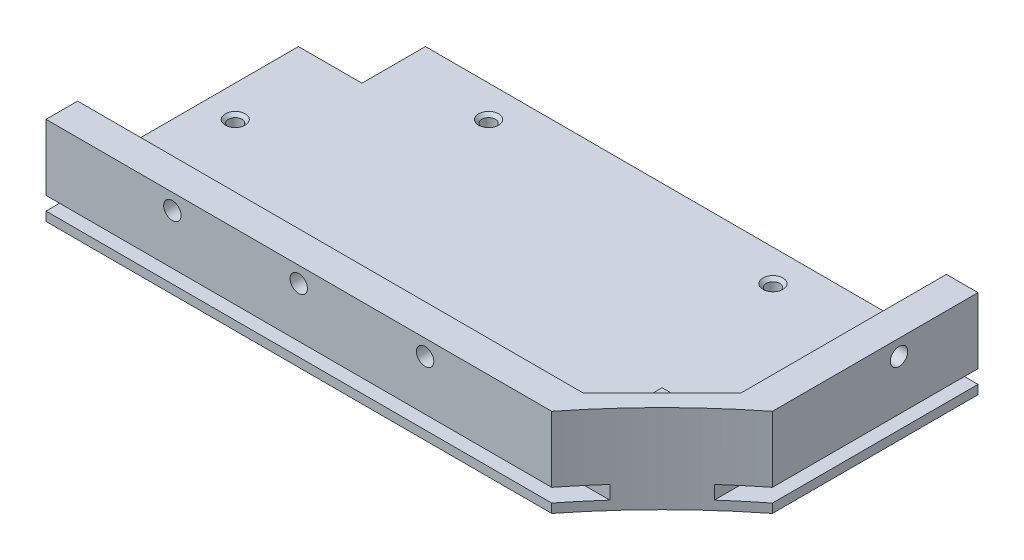
ISO-10303-21;
HEADER;
FILE_DESCRIPTION(('STEP AP214'),'2;1');
FILE_NAME('part.step','',(''),(''),'','','');
FILE_SCHEMA(('AUTOMOTIVE_DESIGN { 1 0 10303 214 1 1 1 1 }'));
ENDSEC;
DATA;
#1=APPLICATION_CONTEXT('core data for automotive mechanical design processes');
#2=APPLICATION_PROTOCOL_DEFINITION('international standard','automotive_design',2000,#1);
#3=PRODUCT_CONTEXT('',#1,'mechanical');
#4=PRODUCT('Part','Part','',(#3));
#5=PRODUCT_RELATED_PRODUCT_CATEGORY('part','',(#4));
#6=PRODUCT_DEFINITION_FORMATION('','',#4);
#7=PRODUCT_DEFINITION_CONTEXT('part definition',#1,'design');
#8=PRODUCT_DEFINITION('design','',#6,#7);
#9=PRODUCT_DEFINITION_SHAPE('','',#8);
#10=(LENGTH_UNIT() NAMED_UNIT(*) SI_UNIT(.MILLI.,.METRE.));
#11=(NAMED_UNIT(*) PLANE_ANGLE_UNIT() SI_UNIT($,.RADIAN.));
#12=(NAMED_UNIT(*) SI_UNIT($,.STERADIAN.) SOLID_ANGLE_UNIT());
#13=UNCERTAINTY_MEASURE_WITH_UNIT(LENGTH_MEASURE(1.E-05),#10,'distance_accuracy_value','');
#14=(GEOMETRIC_REPRESENTATION_CONTEXT(3) GLOBAL_UNCERTAINTY_ASSIGNED_CONTEXT((#13)) GLOBAL_UNIT_ASSIGNED_CONTEXT((#10,
#11,#12)) REPRESENTATION_CONTEXT('',''));
#15=CARTESIAN_POINT('',(0.,0.,0.));
#16=DIRECTION('',(0.,0.,1.));
#17=DIRECTION('',(1.,0.,0.));
#18=AXIS2_PLACEMENT_3D('',#15,#16,#17);
#19=CARTESIAN_POINT('',(160.08,28.,-429.92));
#20=DIRECTION('',(1.,0.,0.));
#21=DIRECTION('',(0.,0.,-1.));
#22=AXIS2_PLACEMENT_3D('',#19,#20,#21);
#23=PLANE('',#22);
#24=DIRECTION('',(0.,0.,1.));
#25=VECTOR('',#24,1.);
#26=CARTESIAN_POINT('',(160.08,17.,-489.92));
#27=LINE('',#26,#25);
#28=CARTESIAN_POINT('',(160.08,17.,-489.92));
#29=VERTEX_POINT('',#28);
#30=CARTESIAN_POINT('',(160.08,17.,-465.));
#31=VERTEX_POINT('',#30);
#32=EDGE_CURVE('E480',#29,#31,#27,.T.);
#33=ORIENTED_EDGE('',*,*,#32,.F.);
#34=DIRECTION('',(0.,-1.,0.));
#35=VECTOR('',#34,1.);
#36=CARTESIAN_POINT('',(160.08,28.,-489.92));
#37=LINE('',#36,#35);
#38=CARTESIAN_POINT('',(160.08,8.,-489.92));
#39=VERTEX_POINT('',#38);
#40=EDGE_CURVE('E475',#29,#39,#37,.T.);
#41=ORIENTED_EDGE('',*,*,#40,.T.);
#42=DIRECTION('',(0.,0.,-1.));
#43=VECTOR('',#42,1.);
#44=CARTESIAN_POINT('',(160.08,8.,-429.92));
#45=LINE('',#44,#43);
#46=CARTESIAN_POINT('',(160.08,8.,-475.));
#47=VERTEX_POINT('',#46);
#48=EDGE_CURVE('E467',#47,#39,#45,.T.);
#49=ORIENTED_EDGE('',*,*,#48,.F.);
#50=DIRECTION('',(0.,-0.668964731622449,-0.743294146247167));
#51=VECTOR('',#50,1.);
#52=CARTESIAN_POINT('',(160.08,17.,-465.));
#53=LINE('',#52,#51);
#54=EDGE_CURVE('E422',#31,#47,#53,.T.);
#55=ORIENTED_EDGE('',*,*,#54,.F.);
#56=EDGE_LOOP('',(#33,#41,#49,#55));
#57=FACE_BOUND('',#56,.T.);
#58=ADVANCED_FACE('F45',(#57),#23,.F.);
#59=CARTESIAN_POINT('',(0.,0.,-489.92));
#60=DIRECTION('',(0.,0.,1.));
#61=DIRECTION('',(1.,0.,0.));
#62=AXIS2_PLACEMENT_3D('',#59,#60,#61);
#63=PLANE('',#62);
#64=DIRECTION('',(-1.,0.,0.));
#65=VECTOR('',#64,1.);
#66=CARTESIAN_POINT('',(185.,17.,-489.92));
#67=LINE('',#66,#65);
#68=CARTESIAN_POINT('',(185.,17.,-489.92));
#69=VERTEX_POINT('',#68);
#70=EDGE_CURVE('E487',#69,#29,#67,.T.);
#71=ORIENTED_EDGE('',*,*,#70,.F.);
#72=DIRECTION('',(0.743294146247166,0.66896473162245,0.));
#73=VECTOR('',#72,1.);
#74=CARTESIAN_POINT('',(185.,17.,-489.92));
#75=LINE('',#74,#73);
#76=CARTESIAN_POINT('',(175.,8.,-489.92));
#77=VERTEX_POINT('',#76);
#78=EDGE_CURVE('E415',#77,#69,#75,.T.);
#79=ORIENTED_EDGE('',*,*,#78,.F.);
#80=DIRECTION('',(1.,0.,0.));
#81=VECTOR('',#80,1.);
#82=CARTESIAN_POINT('',(160.08,8.,-489.92));
#83=LINE('',#82,#81);
#84=EDGE_CURVE('E472',#39,#77,#83,.T.);
#85=ORIENTED_EDGE('',*,*,#84,.F.);
#86=ORIENTED_EDGE('',*,*,#40,.F.);
#87=EDGE_LOOP('',(#71,#79,#85,#86));
#88=FACE_BOUND('',#87,.T.);
#89=ADVANCED_FACE('F292',(#88),#63,.F.);
#90=CARTESIAN_POINT('',(0.,8.,0.));
#91=DIRECTION('',(0.,-1.,0.));
#92=DIRECTION('',(0.,0.,-1.));
#93=AXIS2_PLACEMENT_3D('',#90,#91,#92);
#94=PLANE('',#93);
#95=CARTESIAN_POINT('',(140.1,8.,-545.));
#96=DIRECTION('',(0.,-1.,0.));
#97=DIRECTION('',(0.,0.,-1.));
#98=AXIS2_PLACEMENT_3D('',#95,#96,#97);
#99=CIRCLE('',#98,3.14999999999999);
#100=CARTESIAN_POINT('',(140.1,8.,-548.15));
#101=VERTEX_POINT('',#100);
#102=EDGE_CURVE('E269',#101,#101,#99,.T.);
#103=ORIENTED_EDGE('',*,*,#102,.T.);
#104=EDGE_LOOP('',(#103));
#105=FACE_BOUND('',#104,.T.);
#106=CARTESIAN_POINT('',(50.1,8.,-545.));
#107=DIRECTION('',(0.,-1.,0.));
#108=DIRECTION('',(0.,0.,-1.));
#109=AXIS2_PLACEMENT_3D('',#106,#107,#108);
#110=CIRCLE('',#109,3.14999999999999);
#111=CARTESIAN_POINT('',(50.1,8.,-548.15));
#112=VERTEX_POINT('',#111);
#113=EDGE_CURVE('E266',#112,#112,#110,.T.);
#114=ORIENTED_EDGE('',*,*,#113,.T.);
#115=EDGE_LOOP('',(#114));
#116=FACE_BOUND('',#115,.T.);
#117=CARTESIAN_POINT('',(10.,8.,-504.9));
#118=DIRECTION('',(0.,-1.,0.));
#119=DIRECTION('',(0.,0.,-1.));
#120=AXIS2_PLACEMENT_3D('',#117,#118,#119);
#121=CIRCLE('',#120,3.14999999999999);
#122=CARTESIAN_POINT('',(10.,8.,-508.05));
#123=VERTEX_POINT('',#122);
#124=EDGE_CURVE('E263',#123,#123,#121,.T.);
#125=ORIENTED_EDGE('',*,*,#124,.T.);
#126=EDGE_LOOP('',(#125));
#127=FACE_BOUND('',#126,.T.);
#128=DIRECTION('',(-1.,0.,0.));
#129=VECTOR('',#128,1.);
#130=CARTESIAN_POINT('',(0.,8.,-555.));
#131=LINE('',#130,#129);
#132=CARTESIAN_POINT('',(175.,8.,-555.));
#133=VERTEX_POINT('',#132);
#134=CARTESIAN_POINT('',(20.1,8.,-555.));
#135=VERTEX_POINT('',#134);
#136=EDGE_CURVE('E509',#133,#135,#131,.T.);
#137=ORIENTED_EDGE('',*,*,#136,.T.);
#138=DIRECTION('',(0.,0.,1.));
#139=VECTOR('',#138,1.);
#140=CARTESIAN_POINT('',(20.1000000000001,8.,0.));
#141=LINE('',#140,#139);
#142=CARTESIAN_POINT('',(20.1,8.,-534.9));
#143=VERTEX_POINT('',#142);
#144=EDGE_CURVE('E61',#135,#143,#141,.T.);
#145=ORIENTED_EDGE('',*,*,#144,.T.);
#146=DIRECTION('',(-1.,0.,0.));
#147=VECTOR('',#146,1.);
#148=CARTESIAN_POINT('',(0.,8.,-534.9));
#149=LINE('',#148,#147);
#150=CARTESIAN_POINT('',(0.,8.,-534.9));
#151=VERTEX_POINT('',#150);
#152=EDGE_CURVE('E532',#143,#151,#149,.T.);
#153=ORIENTED_EDGE('',*,*,#152,.T.);
#154=DIRECTION('',(0.,0.,1.));
#155=VECTOR('',#154,1.);
#156=CARTESIAN_POINT('',(0.,8.,0.));
#157=LINE('',#156,#155);
#158=CARTESIAN_POINT('',(0.,8.,-475.));
#159=VERTEX_POINT('',#158);
#160=EDGE_CURVE('E215',#151,#159,#157,.T.);
#161=ORIENTED_EDGE('',*,*,#160,.T.);
#162=DIRECTION('',(-1.,0.,0.));
#163=VECTOR('',#162,1.);
#164=CARTESIAN_POINT('',(160.08,8.,-475.));
#165=LINE('',#164,#163);
#166=EDGE_CURVE('E418',#47,#159,#165,.T.);
#167=ORIENTED_EDGE('',*,*,#166,.F.);
#168=ORIENTED_EDGE('',*,*,#48,.T.);
#169=ORIENTED_EDGE('',*,*,#84,.T.);
#170=DIRECTION('',(0.,0.,-1.));
#171=VECTOR('',#170,1.);
#172=CARTESIAN_POINT('',(175.,8.,-489.92));
#173=LINE('',#172,#171);
#174=EDGE_CURVE('E401',#77,#133,#173,.T.);
#175=ORIENTED_EDGE('',*,*,#174,.T.);
#176=EDGE_LOOP('',(#137,#145,#153,#161,#167,#168,#169,#175));
#177=FACE_BOUND('',#176,.T.);
#178=ADVANCED_FACE('F299',(#105,#116,#127,#177),#94,.F.);
#179=CARTESIAN_POINT('',(195.,0.,-489.924225024707));
#180=DIRECTION('',(1.,0.,0.));
#181=DIRECTION('',(0.,0.,-1.));
#182=AXIS2_PLACEMENT_3D('',#179,#180,#181);
#183=PLANE('',#182);
#184=DIRECTION('',(0.,1.,0.));
#185=VECTOR('',#184,1.);
#186=CARTESIAN_POINT('',(195.,0.,-555.));
#187=LINE('',#186,#185);
#188=CARTESIAN_POINT('',(195.,7.15,-555.));
#189=VERTEX_POINT('',#188);
#190=CARTESIAN_POINT('',(195.,28.,-555.));
#191=VERTEX_POINT('',#190);
#192=EDGE_CURVE('E527',#189,#191,#187,.T.);
#193=ORIENTED_EDGE('',*,*,#192,.T.);
#194=DIRECTION('',(0.,0.,-1.));
#195=VECTOR('',#194,1.);
#196=CARTESIAN_POINT('',(195.,28.,-489.92));
#197=LINE('',#196,#195);
#198=CARTESIAN_POINT('',(195.,28.,-489.924225024706));
#199=VERTEX_POINT('',#198);
#200=EDGE_CURVE('E400',#199,#191,#197,.T.);
#201=ORIENTED_EDGE('',*,*,#200,.F.);
#202=DIRECTION('',(0.,1.,0.));
#203=VECTOR('',#202,1.);
#204=CARTESIAN_POINT('',(195.,0.,-489.924225024707));
#205=LINE('',#204,#203);
#206=CARTESIAN_POINT('',(195.,7.15,-489.924225024707));
#207=VERTEX_POINT('',#206);
#208=EDGE_CURVE('E232',#199,#207,#205,.F.);
#209=ORIENTED_EDGE('',*,*,#208,.T.);
#210=DIRECTION('',(0.,0.,1.));
#211=VECTOR('',#210,1.);
#212=CARTESIAN_POINT('',(195.,7.15,-489.924225024707));
#213=LINE('',#212,#211);
#214=EDGE_CURVE('E245',#189,#207,#213,.T.);
#215=ORIENTED_EDGE('',*,*,#214,.F.);
#216=EDGE_LOOP('',(#193,#201,#209,#215));
#217=FACE_BOUND('',#216,.T.);
#218=CARTESIAN_POINT('',(195.,23.,-530.));
#219=DIRECTION('',(1.,0.,0.));
#220=DIRECTION('',(0.,0.,-1.));
#221=AXIS2_PLACEMENT_3D('',#218,#219,#220);
#222=CIRCLE('',#221,2.75000000000004);
#223=CARTESIAN_POINT('',(195.,23.,-532.75));
#224=VERTEX_POINT('',#223);
#225=EDGE_CURVE('E484',#224,#224,#222,.T.);
#226=ORIENTED_EDGE('',*,*,#225,.F.);
#227=EDGE_LOOP('',(#226));
#228=FACE_BOUND('',#227,.T.);
#229=ADVANCED_FACE('F355',(#217,#228),#183,.T.);
#230=CARTESIAN_POINT('',(195.,0.,-455.));
#231=DIRECTION('',(0.,0.,1.));
#232=DIRECTION('',(1.,0.,0.));
#233=AXIS2_PLACEMENT_3D('',#230,#231,#232);
#234=PLANE('',#233);
#235=DIRECTION('',(1.,0.,0.));
#236=VECTOR('',#235,1.);
#237=CARTESIAN_POINT('',(195.,2.85,-455.));
#238=LINE('',#237,#236);
#239=CARTESIAN_POINT('',(0.,2.85,-455.));
#240=VERTEX_POINT('',#239);
#241=CARTESIAN_POINT('',(160.075774975293,2.85,-455.));
#242=VERTEX_POINT('',#241);
#243=EDGE_CURVE('E237',#240,#242,#238,.T.);
#244=ORIENTED_EDGE('',*,*,#243,.F.);
#245=DIRECTION('',(0.,1.,0.));
#246=VECTOR('',#245,1.);
#247=CARTESIAN_POINT('',(0.,0.,-455.));
#248=LINE('',#247,#246);
#249=CARTESIAN_POINT('',(0.,0.,-455.));
#250=VERTEX_POINT('',#249);
#251=EDGE_CURVE('E225',#250,#240,#248,.T.);
#252=ORIENTED_EDGE('',*,*,#251,.F.);
#253=DIRECTION('',(1.,0.,0.));
#254=VECTOR('',#253,1.);
#255=CARTESIAN_POINT('',(160.075774975293,0.,-455.));
#256=LINE('',#255,#254);
#257=CARTESIAN_POINT('',(160.075774975293,0.,-455.));
#258=VERTEX_POINT('',#257);
#259=EDGE_CURVE('E220',#250,#258,#256,.T.);
#260=ORIENTED_EDGE('',*,*,#259,.T.);
#261=DIRECTION('',(0.,1.,0.));
#262=VECTOR('',#261,1.);
#263=CARTESIAN_POINT('',(160.075774975293,0.,-455.));
#264=LINE('',#263,#262);
#265=EDGE_CURVE('E228',#258,#242,#264,.T.);
#266=ORIENTED_EDGE('',*,*,#265,.T.);
#267=EDGE_LOOP('',(#244,#252,#260,#266));
#268=FACE_BOUND('',#267,.T.);
#269=ADVANCED_FACE('F360',(#268),#234,.T.);
#270=CARTESIAN_POINT('',(0.,8.,0.));
#271=DIRECTION('',(1.,0.,0.));
#272=DIRECTION('',(0.,0.,-1.));
#273=AXIS2_PLACEMENT_3D('',#270,#271,#272);
#274=PLANE('',#273);
#275=ORIENTED_EDGE('',*,*,#160,.F.);
#276=DIRECTION('',(0.,1.,0.));
#277=VECTOR('',#276,1.);
#278=CARTESIAN_POINT('',(0.,0.,-534.9));
#279=LINE('',#278,#277);
#280=CARTESIAN_POINT('',(0.,0.,-534.9));
#281=VERTEX_POINT('',#280);
#282=EDGE_CURVE('E198',#281,#151,#279,.T.);
#283=ORIENTED_EDGE('',*,*,#282,.F.);
#284=DIRECTION('',(0.,0.,1.));
#285=VECTOR('',#284,1.);
#286=CARTESIAN_POINT('',(0.,0.,0.));
#287=LINE('',#286,#285);
#288=EDGE_CURVE('E212',#281,#250,#287,.T.);
#289=ORIENTED_EDGE('',*,*,#288,.T.);
#290=ORIENTED_EDGE('',*,*,#251,.T.);
#291=DIRECTION('',(0.,0.,1.));
#292=VECTOR('',#291,1.);
#293=CARTESIAN_POINT('',(0.,2.85,-465.));
#294=LINE('',#293,#292);
#295=CARTESIAN_POINT('',(0.,2.85,-465.));
#296=VERTEX_POINT('',#295);
#297=EDGE_CURVE('E391',#296,#240,#294,.T.);
#298=ORIENTED_EDGE('',*,*,#297,.F.);
#299=DIRECTION('',(0.,-1.,0.));
#300=VECTOR('',#299,1.);
#301=CARTESIAN_POINT('',(0.,7.15,-465.));
#302=LINE('',#301,#300);
#303=CARTESIAN_POINT('',(0.,7.15,-465.));
#304=VERTEX_POINT('',#303);
#305=EDGE_CURVE('E451',#304,#296,#302,.T.);
#306=ORIENTED_EDGE('',*,*,#305,.F.);
#307=DIRECTION('',(0.,0.,-1.));
#308=VECTOR('',#307,1.);
#309=CARTESIAN_POINT('',(0.,7.15,-455.));
#310=LINE('',#309,#308);
#311=CARTESIAN_POINT('',(0.,7.15,-455.));
#312=VERTEX_POINT('',#311);
#313=EDGE_CURVE('E454',#312,#304,#310,.T.);
#314=ORIENTED_EDGE('',*,*,#313,.F.);
#315=CARTESIAN_POINT('',(0.,28.,-455.));
#316=VERTEX_POINT('',#315);
#317=EDGE_CURVE('E392',#312,#316,#248,.T.);
#318=ORIENTED_EDGE('',*,*,#317,.T.);
#319=DIRECTION('',(0.,0.,-1.));
#320=VECTOR('',#319,1.);
#321=CARTESIAN_POINT('',(0.,28.,-455.));
#322=LINE('',#321,#320);
#323=CARTESIAN_POINT('',(0.,28.,-465.));
#324=VERTEX_POINT('',#323);
#325=EDGE_CURVE('E434',#316,#324,#322,.T.);
#326=ORIENTED_EDGE('',*,*,#325,.T.);
#327=DIRECTION('',(0.,-1.,0.));
#328=VECTOR('',#327,1.);
#329=CARTESIAN_POINT('',(0.,28.,-465.));
#330=LINE('',#329,#328);
#331=CARTESIAN_POINT('',(0.,17.,-465.));
#332=VERTEX_POINT('',#331);
#333=EDGE_CURVE('E431',#324,#332,#330,.T.);
#334=ORIENTED_EDGE('',*,*,#333,.T.);
#335=DIRECTION('',(0.,-0.668964731622449,-0.743294146247167));
#336=VECTOR('',#335,1.);
#337=CARTESIAN_POINT('',(0.,17.,-465.));
#338=LINE('',#337,#336);
#339=EDGE_CURVE('E428',#332,#159,#338,.T.);
#340=ORIENTED_EDGE('',*,*,#339,.T.);
#341=EDGE_LOOP('',(#275,#283,#289,#290,#298,#306,#314,#318,#326,#334,#340));
#342=FACE_BOUND('',#341,.T.);
#343=ADVANCED_FACE('F210',(#342),#274,.F.);
#344=CARTESIAN_POINT('',(0.,0.,0.));
#345=DIRECTION('',(0.,-1.,0.));
#346=DIRECTION('',(0.,0.,-1.));
#347=AXIS2_PLACEMENT_3D('',#344,#345,#346);
#348=PLANE('',#347);
#349=CARTESIAN_POINT('',(10.,0.,-504.9));
#350=DIRECTION('',(0.,-1.,0.));
#351=DIRECTION('',(0.,0.,-1.));
#352=AXIS2_PLACEMENT_3D('',#349,#350,#351);
#353=CIRCLE('',#352,2.15000000000002);
#354=CARTESIAN_POINT('',(10.,0.,-507.05));
#355=VERTEX_POINT('',#354);
#356=EDGE_CURVE('E206',#355,#355,#353,.T.);
#357=ORIENTED_EDGE('',*,*,#356,.F.);
#358=EDGE_LOOP('',(#357));
#359=FACE_BOUND('',#358,.T.);
#360=CARTESIAN_POINT('',(140.1,0.,-545.));
#361=DIRECTION('',(0.,-1.,0.));
#362=DIRECTION('',(0.,0.,-1.));
#363=AXIS2_PLACEMENT_3D('',#360,#361,#362);
#364=CIRCLE('',#363,2.15000000000002);
#365=CARTESIAN_POINT('',(140.1,0.,-547.15));
#366=VERTEX_POINT('',#365);
#367=EDGE_CURVE('E256',#366,#366,#364,.T.);
#368=ORIENTED_EDGE('',*,*,#367,.F.);
#369=EDGE_LOOP('',(#368));
#370=FACE_BOUND('',#369,.T.);
#371=CARTESIAN_POINT('',(50.1,0.,-545.));
#372=DIRECTION('',(0.,-1.,0.));
#373=DIRECTION('',(0.,0.,-1.));
#374=AXIS2_PLACEMENT_3D('',#371,#372,#373);
#375=CIRCLE('',#374,2.15000000000003);
#376=CARTESIAN_POINT('',(50.1,0.,-547.15));
#377=VERTEX_POINT('',#376);
#378=EDGE_CURVE('E253',#377,#377,#375,.T.);
#379=ORIENTED_EDGE('',*,*,#378,.F.);
#380=EDGE_LOOP('',(#379));
#381=FACE_BOUND('',#380,.T.);
#382=DIRECTION('',(0.,0.,-1.));
#383=VECTOR('',#382,1.);
#384=CARTESIAN_POINT('',(20.1,0.,-555.));
#385=LINE('',#384,#383);
#386=CARTESIAN_POINT('',(20.1,0.,-534.9));
#387=VERTEX_POINT('',#386);
#388=CARTESIAN_POINT('',(20.1,0.,-555.));
#389=VERTEX_POINT('',#388);
#390=EDGE_CURVE('E205',#387,#389,#385,.T.);
#391=ORIENTED_EDGE('',*,*,#390,.T.);
#392=DIRECTION('',(1.,0.,0.));
#393=VECTOR('',#392,1.);
#394=CARTESIAN_POINT('',(195.,0.,-555.));
#395=LINE('',#394,#393);
#396=CARTESIAN_POINT('',(195.,0.,-555.));
#397=VERTEX_POINT('',#396);
#398=EDGE_CURVE('E528',#389,#397,#395,.T.);
#399=ORIENTED_EDGE('',*,*,#398,.T.);
#400=DIRECTION('',(0.,0.,-1.));
#401=VECTOR('',#400,1.);
#402=CARTESIAN_POINT('',(195.,0.,-455.));
#403=LINE('',#402,#401);
#404=CARTESIAN_POINT('',(195.,0.,-489.924225024707));
#405=VERTEX_POINT('',#404);
#406=EDGE_CURVE('E395',#405,#397,#403,.T.);
#407=ORIENTED_EDGE('',*,*,#406,.F.);
#408=CARTESIAN_POINT('',(325.,0.,-325.));
#409=DIRECTION('',(0.,1.,0.));
#410=DIRECTION('',(0.,0.,1.));
#411=AXIS2_PLACEMENT_3D('',#408,#409,#410);
#412=CIRCLE('',#411,210.);
#413=EDGE_CURVE('E221',#405,#258,#412,.T.);
#414=ORIENTED_EDGE('',*,*,#413,.T.);
#415=ORIENTED_EDGE('',*,*,#259,.F.);
#416=ORIENTED_EDGE('',*,*,#288,.F.);
#417=DIRECTION('',(1.,0.,0.));
#418=VECTOR('',#417,1.);
#419=CARTESIAN_POINT('',(20.1,0.,-534.9));
#420=LINE('',#419,#418);
#421=EDGE_CURVE('E195',#281,#387,#420,.T.);
#422=ORIENTED_EDGE('',*,*,#421,.T.);
#423=EDGE_LOOP('',(#391,#399,#407,#414,#415,#416,#422));
#424=FACE_BOUND('',#423,.T.);
#425=ADVANCED_FACE('F218',(#359,#370,#381,#424),#348,.T.);
#426=CARTESIAN_POINT('',(325.,0.,-325.));
#427=DIRECTION('',(0.,1.,0.));
#428=DIRECTION('',(0.,0.,1.));
#429=AXIS2_PLACEMENT_3D('',#426,#427,#428);
#430=CYLINDRICAL_SURFACE('',#429,210.);
#431=ORIENTED_EDGE('',*,*,#208,.F.);
#432=CARTESIAN_POINT('',(325.,28.,-325.));
#433=DIRECTION('',(0.,1.,0.));
#434=DIRECTION('',(0.,0.,1.));
#435=AXIS2_PLACEMENT_3D('',#432,#433,#434);
#436=CIRCLE('',#435,210.);
#437=CARTESIAN_POINT('',(160.075774975294,28.,-455.));
#438=VERTEX_POINT('',#437);
#439=EDGE_CURVE('E477',#199,#438,#436,.T.);
#440=ORIENTED_EDGE('',*,*,#439,.T.);
#441=CARTESIAN_POINT('',(160.075774975293,7.15,-455.));
#442=VERTEX_POINT('',#441);
#443=EDGE_CURVE('E223',#442,#438,#264,.T.);
#444=ORIENTED_EDGE('',*,*,#443,.F.);
#445=CARTESIAN_POINT('',(325.,7.15000000000001,-325.));
#446=DIRECTION('',(0.,1.,0.));
#447=DIRECTION('',(0.,0.,1.));
#448=AXIS2_PLACEMENT_3D('',#445,#446,#447);
#449=CIRCLE('',#448,210.);
#450=CARTESIAN_POINT('',(168.475241575015,7.15,-465.));
#451=VERTEX_POINT('',#450);
#452=EDGE_CURVE('E443',#442,#451,#449,.F.);
#453=ORIENTED_EDGE('',*,*,#452,.T.);
#454=DIRECTION('',(0.,1.,0.));
#455=VECTOR('',#454,1.);
#456=CARTESIAN_POINT('',(168.475241575015,0.,-465.));
#457=LINE('',#456,#455);
#458=CARTESIAN_POINT('',(168.475241575015,2.85,-465.));
#459=VERTEX_POINT('',#458);
#460=EDGE_CURVE('E239',#451,#459,#457,.F.);
#461=ORIENTED_EDGE('',*,*,#460,.T.);
#462=CARTESIAN_POINT('',(325.,2.85,-325.));
#463=DIRECTION('',(0.,-1.,0.));
#464=DIRECTION('',(0.,0.,-1.));
#465=AXIS2_PLACEMENT_3D('',#462,#463,#464);
#466=CIRCLE('',#465,210.);
#467=EDGE_CURVE('E437',#459,#242,#466,.F.);
#468=ORIENTED_EDGE('',*,*,#467,.T.);
#469=ORIENTED_EDGE('',*,*,#265,.F.);
#470=ORIENTED_EDGE('',*,*,#413,.F.);
#471=CARTESIAN_POINT('',(195.,2.85,-489.924225024707));
#472=VERTEX_POINT('',#471);
#473=EDGE_CURVE('E231',#472,#405,#205,.F.);
#474=ORIENTED_EDGE('',*,*,#473,.F.);
#475=CARTESIAN_POINT('',(325.,2.84999999999998,-325.));
#476=DIRECTION('',(0.,-1.,0.));
#477=DIRECTION('',(1.,0.,0.));
#478=AXIS2_PLACEMENT_3D('',#475,#476,#477);
#479=CIRCLE('',#478,210.);
#480=CARTESIAN_POINT('',(185.,2.85,-481.524758424985));
#481=VERTEX_POINT('',#480);
#482=EDGE_CURVE('E460',#472,#481,#479,.F.);
#483=ORIENTED_EDGE('',*,*,#482,.T.);
#484=DIRECTION('',(0.,1.,0.));
#485=VECTOR('',#484,1.);
#486=CARTESIAN_POINT('',(185.,0.,-481.524758424985));
#487=LINE('',#486,#485);
#488=CARTESIAN_POINT('',(185.,7.15,-481.524758424985));
#489=VERTEX_POINT('',#488);
#490=EDGE_CURVE('E247',#481,#489,#487,.T.);
#491=ORIENTED_EDGE('',*,*,#490,.T.);
#492=CARTESIAN_POINT('',(325.,7.15,-325.));
#493=DIRECTION('',(0.,1.,0.));
#494=DIRECTION('',(0.,0.,1.));
#495=AXIS2_PLACEMENT_3D('',#492,#493,#494);
#496=CIRCLE('',#495,210.);
#497=EDGE_CURVE('E457',#489,#207,#496,.F.);
#498=ORIENTED_EDGE('',*,*,#497,.T.);
#499=EDGE_LOOP('',(#431,#440,#444,#453,#461,#468,#469,#470,#474,#483,#491,#498));
#500=FACE_BOUND('',#499,.T.);
#501=ADVANCED_FACE('F358',(#500),#430,.F.);
#502=CARTESIAN_POINT('',(120.,23.,-455.));
#503=DIRECTION('',(0.,0.,1.));
#504=DIRECTION('',(1.,0.,0.));
#505=AXIS2_PLACEMENT_3D('',#502,#503,#504);
#506=CIRCLE('',#505,2.75000000000001);
#507=CARTESIAN_POINT('',(122.75,23.,-455.));
#508=VERTEX_POINT('',#507);
#509=EDGE_CURVE('E495',#508,#508,#506,.T.);
#510=ORIENTED_EDGE('',*,*,#509,.F.);
#511=EDGE_LOOP('',(#510));
#512=FACE_BOUND('',#511,.T.);
#513=CARTESIAN_POINT('',(80.,23.,-455.));
#514=DIRECTION('',(0.,0.,1.));
#515=DIRECTION('',(1.,0.,0.));
#516=AXIS2_PLACEMENT_3D('',#513,#514,#515);
#517=CIRCLE('',#516,2.75000000000001);
#518=CARTESIAN_POINT('',(82.75,23.,-455.));
#519=VERTEX_POINT('',#518);
#520=EDGE_CURVE('E498',#519,#519,#517,.T.);
#521=ORIENTED_EDGE('',*,*,#520,.F.);
#522=EDGE_LOOP('',(#521));
#523=FACE_BOUND('',#522,.T.);
#524=CARTESIAN_POINT('',(40.,23.,-455.));
#525=DIRECTION('',(0.,0.,1.));
#526=DIRECTION('',(1.,0.,0.));
#527=AXIS2_PLACEMENT_3D('',#524,#525,#526);
#528=CIRCLE('',#527,2.75);
#529=CARTESIAN_POINT('',(42.75,23.,-455.));
#530=VERTEX_POINT('',#529);
#531=EDGE_CURVE('E501',#530,#530,#528,.T.);
#532=ORIENTED_EDGE('',*,*,#531,.F.);
#533=EDGE_LOOP('',(#532));
#534=FACE_BOUND('',#533,.T.);
#535=ORIENTED_EDGE('',*,*,#443,.T.);
#536=DIRECTION('',(-1.,0.,0.));
#537=VECTOR('',#536,1.);
#538=CARTESIAN_POINT('',(160.08,28.,-455.));
#539=LINE('',#538,#537);
#540=EDGE_CURVE('E419',#438,#316,#539,.T.);
#541=ORIENTED_EDGE('',*,*,#540,.T.);
#542=ORIENTED_EDGE('',*,*,#317,.F.);
#543=DIRECTION('',(-1.,0.,0.));
#544=VECTOR('',#543,1.);
#545=CARTESIAN_POINT('',(195.,7.15,-455.));
#546=LINE('',#545,#544);
#547=EDGE_CURVE('E235',#442,#312,#546,.T.);
#548=ORIENTED_EDGE('',*,*,#547,.F.);
#549=EDGE_LOOP('',(#535,#541,#542,#548));
#550=FACE_BOUND('',#549,.T.);
#551=ADVANCED_FACE('F353',(#512,#523,#534,#550),#234,.T.);
#552=CARTESIAN_POINT('',(195.,2.85,-555.));
#553=VERTEX_POINT('',#552);
#554=EDGE_CURVE('E524',#397,#553,#187,.T.);
#555=ORIENTED_EDGE('',*,*,#554,.T.);
#556=DIRECTION('',(0.,0.,-1.));
#557=VECTOR('',#556,1.);
#558=CARTESIAN_POINT('',(195.,2.85,-489.924225024707));
#559=LINE('',#558,#557);
#560=EDGE_CURVE('E242',#472,#553,#559,.T.);
#561=ORIENTED_EDGE('',*,*,#560,.F.);
#562=ORIENTED_EDGE('',*,*,#473,.T.);
#563=ORIENTED_EDGE('',*,*,#406,.T.);
#564=EDGE_LOOP('',(#555,#561,#562,#563));
#565=FACE_BOUND('',#564,.T.);
#566=ADVANCED_FACE('F343',(#565),#183,.T.);
#567=CARTESIAN_POINT('',(195.,28.,-489.92));
#568=DIRECTION('',(0.,1.,0.));
#569=DIRECTION('',(0.,0.,1.));
#570=AXIS2_PLACEMENT_3D('',#567,#568,#569);
#571=PLANE('',#570);
#572=DIRECTION('',(1.,0.,0.));
#573=VECTOR('',#572,1.);
#574=CARTESIAN_POINT('',(195.,28.,-555.));
#575=LINE('',#574,#573);
#576=CARTESIAN_POINT('',(185.,28.,-555.));
#577=VERTEX_POINT('',#576);
#578=EDGE_CURVE('E530',#577,#191,#575,.T.);
#579=ORIENTED_EDGE('',*,*,#578,.F.);
#580=DIRECTION('',(0.,0.,-1.));
#581=VECTOR('',#580,1.);
#582=CARTESIAN_POINT('',(185.,28.,-489.92));
#583=LINE('',#582,#581);
#584=CARTESIAN_POINT('',(185.,28.,-489.92));
#585=VERTEX_POINT('',#584);
#586=EDGE_CURVE('E408',#585,#577,#583,.T.);
#587=ORIENTED_EDGE('',*,*,#586,.F.);
#588=DIRECTION('',(0.707106781186547,0.,-0.707106781186548));
#589=VECTOR('',#588,1.);
#590=CARTESIAN_POINT('',(160.08,28.,-465.));
#591=LINE('',#590,#589);
#592=CARTESIAN_POINT('',(160.08,28.,-465.));
#593=VERTEX_POINT('',#592);
#594=EDGE_CURVE('E481',#593,#585,#591,.T.);
#595=ORIENTED_EDGE('',*,*,#594,.F.);
#596=DIRECTION('',(-1.,0.,0.));
#597=VECTOR('',#596,1.);
#598=CARTESIAN_POINT('',(160.08,28.,-465.));
#599=LINE('',#598,#597);
#600=EDGE_CURVE('E421',#593,#324,#599,.T.);
#601=ORIENTED_EDGE('',*,*,#600,.T.);
#602=ORIENTED_EDGE('',*,*,#325,.F.);
#603=ORIENTED_EDGE('',*,*,#540,.F.);
#604=ORIENTED_EDGE('',*,*,#439,.F.);
#605=ORIENTED_EDGE('',*,*,#200,.T.);
#606=EDGE_LOOP('',(#579,#587,#595,#601,#602,#603,#604,#605));
#607=FACE_BOUND('',#606,.T.);
#608=ADVANCED_FACE('F339',(#607),#571,.T.);
#609=CARTESIAN_POINT('',(185.,28.,-489.92));
#610=DIRECTION('',(-1.,0.,0.));
#611=DIRECTION('',(0.,0.,1.));
#612=AXIS2_PLACEMENT_3D('',#609,#610,#611);
#613=PLANE('',#612);
#614=DIRECTION('',(0.,1.,0.));
#615=VECTOR('',#614,1.);
#616=CARTESIAN_POINT('',(185.,28.,-555.));
#617=LINE('',#616,#615);
#618=CARTESIAN_POINT('',(185.,17.,-555.));
#619=VERTEX_POINT('',#618);
#620=EDGE_CURVE('E516',#619,#577,#617,.T.);
#621=ORIENTED_EDGE('',*,*,#620,.F.);
#622=DIRECTION('',(0.,0.,-1.));
#623=VECTOR('',#622,1.);
#624=CARTESIAN_POINT('',(185.,17.,-489.92));
#625=LINE('',#624,#623);
#626=EDGE_CURVE('E404',#69,#619,#625,.T.);
#627=ORIENTED_EDGE('',*,*,#626,.F.);
#628=DIRECTION('',(0.,1.,0.));
#629=VECTOR('',#628,1.);
#630=CARTESIAN_POINT('',(185.,28.,-489.92));
#631=LINE('',#630,#629);
#632=EDGE_CURVE('E405',#69,#585,#631,.T.);
#633=ORIENTED_EDGE('',*,*,#632,.T.);
#634=ORIENTED_EDGE('',*,*,#586,.T.);
#635=EDGE_LOOP('',(#621,#627,#633,#634));
#636=FACE_BOUND('',#635,.T.);
#637=CARTESIAN_POINT('',(185.,23.,-530.));
#638=DIRECTION('',(-1.,0.,0.));
#639=DIRECTION('',(0.,0.,1.));
#640=AXIS2_PLACEMENT_3D('',#637,#638,#639);
#641=CIRCLE('',#640,2.75000000000004);
#642=CARTESIAN_POINT('',(185.,23.,-527.25));
#643=VERTEX_POINT('',#642);
#644=EDGE_CURVE('E492',#643,#643,#641,.T.);
#645=ORIENTED_EDGE('',*,*,#644,.F.);
#646=EDGE_LOOP('',(#645));
#647=FACE_BOUND('',#646,.T.);
#648=ADVANCED_FACE('F342',(#636,#647),#613,.T.);
#649=CARTESIAN_POINT('',(185.,17.,-489.92));
#650=DIRECTION('',(-0.66896473162245,0.743294146247166,0.));
#651=DIRECTION('',(-0.743294146247166,-0.668964731622451,0.));
#652=AXIS2_PLACEMENT_3D('',#649,#650,#651);
#653=PLANE('',#652);
#654=DIRECTION('',(0.743294146247166,0.668964731622451,0.));
#655=VECTOR('',#654,1.);
#656=CARTESIAN_POINT('',(185.,17.,-555.));
#657=LINE('',#656,#655);
#658=EDGE_CURVE('E518',#133,#619,#657,.T.);
#659=ORIENTED_EDGE('',*,*,#658,.F.);
#660=ORIENTED_EDGE('',*,*,#174,.F.);
#661=ORIENTED_EDGE('',*,*,#78,.T.);
#662=ORIENTED_EDGE('',*,*,#626,.T.);
#663=EDGE_LOOP('',(#659,#660,#661,#662));
#664=FACE_BOUND('',#663,.T.);
#665=ADVANCED_FACE('F334',(#664),#653,.T.);
#666=CARTESIAN_POINT('',(160.08,17.,-465.));
#667=DIRECTION('',(0.,0.743294146247167,-0.66896473162245));
#668=DIRECTION('',(0.,0.668964731622449,0.743294146247167));
#669=AXIS2_PLACEMENT_3D('',#666,#667,#668);
#670=PLANE('',#669);
#671=ORIENTED_EDGE('',*,*,#339,.F.);
#672=DIRECTION('',(-1.,0.,0.));
#673=VECTOR('',#672,1.);
#674=CARTESIAN_POINT('',(160.08,17.,-465.));
#675=LINE('',#674,#673);
#676=EDGE_CURVE('E424',#31,#332,#675,.T.);
#677=ORIENTED_EDGE('',*,*,#676,.F.);
#678=ORIENTED_EDGE('',*,*,#54,.T.);
#679=ORIENTED_EDGE('',*,*,#166,.T.);
#680=EDGE_LOOP('',(#671,#677,#678,#679));
#681=FACE_BOUND('',#680,.T.);
#682=ADVANCED_FACE('F331',(#681),#670,.T.);
#683=CARTESIAN_POINT('',(160.08,28.,-465.));
#684=DIRECTION('',(0.,0.,-1.));
#685=DIRECTION('',(-1.,0.,0.));
#686=AXIS2_PLACEMENT_3D('',#683,#684,#685);
#687=PLANE('',#686);
#688=CARTESIAN_POINT('',(120.,23.,-465.));
#689=DIRECTION('',(0.,0.,-1.));
#690=DIRECTION('',(-1.,0.,0.));
#691=AXIS2_PLACEMENT_3D('',#688,#689,#690);
#692=CIRCLE('',#691,2.75000000000001);
#693=CARTESIAN_POINT('',(117.25,23.,-465.));
#694=VERTEX_POINT('',#693);
#695=EDGE_CURVE('E504',#694,#694,#692,.T.);
#696=ORIENTED_EDGE('',*,*,#695,.F.);
#697=EDGE_LOOP('',(#696));
#698=FACE_BOUND('',#697,.T.);
#699=CARTESIAN_POINT('',(80.,23.,-465.));
#700=DIRECTION('',(0.,0.,-1.));
#701=DIRECTION('',(-1.,0.,0.));
#702=AXIS2_PLACEMENT_3D('',#699,#700,#701);
#703=CIRCLE('',#702,2.75000000000001);
#704=CARTESIAN_POINT('',(77.25,23.,-465.));
#705=VERTEX_POINT('',#704);
#706=EDGE_CURVE('E508',#705,#705,#703,.T.);
#707=ORIENTED_EDGE('',*,*,#706,.F.);
#708=EDGE_LOOP('',(#707));
#709=FACE_BOUND('',#708,.T.);
#710=CARTESIAN_POINT('',(40.,23.,-465.));
#711=DIRECTION('',(0.,0.,-1.));
#712=DIRECTION('',(-1.,0.,0.));
#713=AXIS2_PLACEMENT_3D('',#710,#711,#712);
#714=CIRCLE('',#713,2.75);
#715=CARTESIAN_POINT('',(37.25,23.,-465.));
#716=VERTEX_POINT('',#715);
#717=EDGE_CURVE('E505',#716,#716,#714,.T.);
#718=ORIENTED_EDGE('',*,*,#717,.F.);
#719=EDGE_LOOP('',(#718));
#720=FACE_BOUND('',#719,.T.);
#721=ORIENTED_EDGE('',*,*,#333,.F.);
#722=ORIENTED_EDGE('',*,*,#600,.F.);
#723=DIRECTION('',(0.,-1.,0.));
#724=VECTOR('',#723,1.);
#725=CARTESIAN_POINT('',(160.08,28.,-465.));
#726=LINE('',#725,#724);
#727=EDGE_CURVE('E430',#593,#31,#726,.T.);
#728=ORIENTED_EDGE('',*,*,#727,.T.);
#729=ORIENTED_EDGE('',*,*,#676,.T.);
#730=EDGE_LOOP('',(#721,#722,#728,#729));
#731=FACE_BOUND('',#730,.T.);
#732=ADVANCED_FACE('F326',(#698,#709,#720,#731),#687,.T.);
#733=CARTESIAN_POINT('',(195.,7.15,-465.));
#734=DIRECTION('',(0.,0.,-1.));
#735=DIRECTION('',(-1.,0.,0.));
#736=AXIS2_PLACEMENT_3D('',#733,#734,#735);
#737=PLANE('',#736);
#738=DIRECTION('',(-1.,0.,0.));
#739=VECTOR('',#738,1.);
#740=CARTESIAN_POINT('',(195.,7.15,-465.));
#741=LINE('',#740,#739);
#742=EDGE_CURVE('E447',#451,#304,#741,.T.);
#743=ORIENTED_EDGE('',*,*,#742,.T.);
#744=ORIENTED_EDGE('',*,*,#305,.T.);
#745=DIRECTION('',(-1.,0.,0.));
#746=VECTOR('',#745,1.);
#747=CARTESIAN_POINT('',(195.,2.85,-465.));
#748=LINE('',#747,#746);
#749=EDGE_CURVE('E446',#459,#296,#748,.T.);
#750=ORIENTED_EDGE('',*,*,#749,.F.);
#751=ORIENTED_EDGE('',*,*,#460,.F.);
#752=EDGE_LOOP('',(#743,#744,#750,#751));
#753=FACE_BOUND('',#752,.T.);
#754=ADVANCED_FACE('F322',(#753),#737,.F.);
#755=CARTESIAN_POINT('',(195.,2.85,-465.));
#756=DIRECTION('',(0.,-1.,0.));
#757=DIRECTION('',(0.,0.,-1.));
#758=AXIS2_PLACEMENT_3D('',#755,#756,#757);
#759=PLANE('',#758);
#760=ORIENTED_EDGE('',*,*,#749,.T.);
#761=ORIENTED_EDGE('',*,*,#297,.T.);
#762=ORIENTED_EDGE('',*,*,#243,.T.);
#763=ORIENTED_EDGE('',*,*,#467,.F.);
#764=EDGE_LOOP('',(#760,#761,#762,#763));
#765=FACE_BOUND('',#764,.T.);
#766=ADVANCED_FACE('F319',(#765),#759,.F.);
#767=CARTESIAN_POINT('',(195.,7.15,-455.));
#768=DIRECTION('',(0.,1.,0.));
#769=DIRECTION('',(0.,0.,1.));
#770=AXIS2_PLACEMENT_3D('',#767,#768,#769);
#771=PLANE('',#770);
#772=ORIENTED_EDGE('',*,*,#547,.T.);
#773=ORIENTED_EDGE('',*,*,#313,.T.);
#774=ORIENTED_EDGE('',*,*,#742,.F.);
#775=ORIENTED_EDGE('',*,*,#452,.F.);
#776=EDGE_LOOP('',(#772,#773,#774,#775));
#777=FACE_BOUND('',#776,.T.);
#778=ADVANCED_FACE('F313',(#777),#771,.F.);
#779=CARTESIAN_POINT('',(185.,7.15,-455.));
#780=DIRECTION('',(-1.,0.,0.));
#781=DIRECTION('',(0.,0.,1.));
#782=AXIS2_PLACEMENT_3D('',#779,#780,#781);
#783=PLANE('',#782);
#784=DIRECTION('',(0.,0.,-1.));
#785=VECTOR('',#784,1.);
#786=CARTESIAN_POINT('',(185.,2.85,-455.));
#787=LINE('',#786,#785);
#788=CARTESIAN_POINT('',(185.,2.85,-555.));
#789=VERTEX_POINT('',#788);
#790=EDGE_CURVE('E464',#481,#789,#787,.T.);
#791=ORIENTED_EDGE('',*,*,#790,.T.);
#792=DIRECTION('',(0.,1.,0.));
#793=VECTOR('',#792,1.);
#794=CARTESIAN_POINT('',(185.,7.15,-555.));
#795=LINE('',#794,#793);
#796=CARTESIAN_POINT('',(185.,7.15,-555.));
#797=VERTEX_POINT('',#796);
#798=EDGE_CURVE('E69',#789,#797,#795,.T.);
#799=ORIENTED_EDGE('',*,*,#798,.T.);
#800=DIRECTION('',(0.,0.,-1.));
#801=VECTOR('',#800,1.);
#802=CARTESIAN_POINT('',(185.,7.15,-455.));
#803=LINE('',#802,#801);
#804=EDGE_CURVE('E463',#489,#797,#803,.T.);
#805=ORIENTED_EDGE('',*,*,#804,.F.);
#806=ORIENTED_EDGE('',*,*,#490,.F.);
#807=EDGE_LOOP('',(#791,#799,#805,#806));
#808=FACE_BOUND('',#807,.T.);
#809=ADVANCED_FACE('F309',(#808),#783,.F.);
#810=CARTESIAN_POINT('',(195.,7.15,-455.));
#811=DIRECTION('',(0.,1.,0.));
#812=DIRECTION('',(0.,0.,1.));
#813=AXIS2_PLACEMENT_3D('',#810,#811,#812);
#814=PLANE('',#813);
#815=ORIENTED_EDGE('',*,*,#804,.T.);
#816=DIRECTION('',(1.,0.,0.));
#817=VECTOR('',#816,1.);
#818=CARTESIAN_POINT('',(195.,7.15,-555.));
#819=LINE('',#818,#817);
#820=EDGE_CURVE('E520',#797,#189,#819,.T.);
#821=ORIENTED_EDGE('',*,*,#820,.T.);
#822=ORIENTED_EDGE('',*,*,#214,.T.);
#823=ORIENTED_EDGE('',*,*,#497,.F.);
#824=EDGE_LOOP('',(#815,#821,#822,#823));
#825=FACE_BOUND('',#824,.T.);
#826=ADVANCED_FACE('F305',(#825),#814,.F.);
#827=CARTESIAN_POINT('',(185.,2.85,-455.));
#828=DIRECTION('',(0.,-1.,0.));
#829=DIRECTION('',(1.,0.,0.));
#830=AXIS2_PLACEMENT_3D('',#827,#828,#829);
#831=PLANE('',#830);
#832=ORIENTED_EDGE('',*,*,#560,.T.);
#833=DIRECTION('',(-1.,0.,0.));
#834=VECTOR('',#833,1.);
#835=CARTESIAN_POINT('',(185.,2.85,-555.));
#836=LINE('',#835,#834);
#837=EDGE_CURVE('E250',#553,#789,#836,.T.);
#838=ORIENTED_EDGE('',*,*,#837,.T.);
#839=ORIENTED_EDGE('',*,*,#790,.F.);
#840=ORIENTED_EDGE('',*,*,#482,.F.);
#841=EDGE_LOOP('',(#832,#838,#839,#840));
#842=FACE_BOUND('',#841,.T.);
#843=ADVANCED_FACE('F308',(#842),#831,.F.);
#844=CARTESIAN_POINT('',(160.08,17.,-465.));
#845=DIRECTION('',(0.707106781186548,0.,0.707106781186547));
#846=DIRECTION('',(0.707106781186547,0.,-0.707106781186548));
#847=AXIS2_PLACEMENT_3D('',#844,#845,#846);
#848=PLANE('',#847);
#849=ORIENTED_EDGE('',*,*,#594,.T.);
#850=ORIENTED_EDGE('',*,*,#632,.F.);
#851=DIRECTION('',(0.707106781186547,0.,-0.707106781186548));
#852=VECTOR('',#851,1.);
#853=CARTESIAN_POINT('',(160.08,17.,-465.));
#854=LINE('',#853,#852);
#855=EDGE_CURVE('E483',#31,#69,#854,.T.);
#856=ORIENTED_EDGE('',*,*,#855,.F.);
#857=ORIENTED_EDGE('',*,*,#727,.F.);
#858=EDGE_LOOP('',(#849,#850,#856,#857));
#859=FACE_BOUND('',#858,.T.);
#860=ADVANCED_FACE('F317',(#859),#848,.F.);
#861=CARTESIAN_POINT('',(0.,17.,0.));
#862=DIRECTION('',(0.,1.,0.));
#863=DIRECTION('',(0.,0.,1.));
#864=AXIS2_PLACEMENT_3D('',#861,#862,#863);
#865=PLANE('',#864);
#866=ORIENTED_EDGE('',*,*,#855,.T.);
#867=ORIENTED_EDGE('',*,*,#70,.T.);
#868=ORIENTED_EDGE('',*,*,#32,.T.);
#869=EDGE_LOOP('',(#866,#867,#868));
#870=FACE_BOUND('',#869,.T.);
#871=ADVANCED_FACE('F594',(#870),#865,.T.);
#872=CARTESIAN_POINT('',(196.,23.,-530.));
#873=DIRECTION('',(-1.,0.,0.));
#874=DIRECTION('',(0.,0.,1.));
#875=AXIS2_PLACEMENT_3D('',#872,#873,#874);
#876=CYLINDRICAL_SURFACE('',#875,2.75000000000004);
#877=ORIENTED_EDGE('',*,*,#225,.T.);
#878=EDGE_LOOP('',(#877));
#879=FACE_BOUND('',#878,.T.);
#880=ORIENTED_EDGE('',*,*,#644,.T.);
#881=EDGE_LOOP('',(#880));
#882=FACE_BOUND('',#881,.T.);
#883=ADVANCED_FACE('F590',(#879,#882),#876,.F.);
#884=CARTESIAN_POINT('',(40.,23.,-454.));
#885=DIRECTION('',(0.,0.,-1.));
#886=DIRECTION('',(-1.,0.,0.));
#887=AXIS2_PLACEMENT_3D('',#884,#885,#886);
#888=CYLINDRICAL_SURFACE('',#887,2.75);
#889=ORIENTED_EDGE('',*,*,#531,.T.);
#890=EDGE_LOOP('',(#889));
#891=FACE_BOUND('',#890,.T.);
#892=ORIENTED_EDGE('',*,*,#717,.T.);
#893=EDGE_LOOP('',(#892));
#894=FACE_BOUND('',#893,.T.);
#895=ADVANCED_FACE('F586',(#891,#894),#888,.F.);
#896=CARTESIAN_POINT('',(80.,23.,-454.));
#897=DIRECTION('',(0.,0.,-1.));
#898=DIRECTION('',(-1.,0.,0.));
#899=AXIS2_PLACEMENT_3D('',#896,#897,#898);
#900=CYLINDRICAL_SURFACE('',#899,2.75000000000001);
#901=ORIENTED_EDGE('',*,*,#520,.T.);
#902=EDGE_LOOP('',(#901));
#903=FACE_BOUND('',#902,.T.);
#904=ORIENTED_EDGE('',*,*,#706,.T.);
#905=EDGE_LOOP('',(#904));
#906=FACE_BOUND('',#905,.T.);
#907=ADVANCED_FACE('F582',(#903,#906),#900,.F.);
#908=CARTESIAN_POINT('',(120.,23.,-454.));
#909=DIRECTION('',(0.,0.,-1.));
#910=DIRECTION('',(-1.,0.,0.));
#911=AXIS2_PLACEMENT_3D('',#908,#909,#910);
#912=CYLINDRICAL_SURFACE('',#911,2.75000000000001);
#913=ORIENTED_EDGE('',*,*,#509,.T.);
#914=EDGE_LOOP('',(#913));
#915=FACE_BOUND('',#914,.T.);
#916=ORIENTED_EDGE('',*,*,#695,.T.);
#917=EDGE_LOOP('',(#916));
#918=FACE_BOUND('',#917,.T.);
#919=ADVANCED_FACE('F579',(#915,#918),#912,.F.);
#920=CARTESIAN_POINT('',(195.,0.,-555.));
#921=DIRECTION('',(0.,0.,1.));
#922=DIRECTION('',(1.,0.,0.));
#923=AXIS2_PLACEMENT_3D('',#920,#921,#922);
#924=PLANE('',#923);
#925=ORIENTED_EDGE('',*,*,#398,.F.);
#926=DIRECTION('',(0.,1.,0.));
#927=VECTOR('',#926,1.);
#928=CARTESIAN_POINT('',(20.1,0.,-555.));
#929=LINE('',#928,#927);
#930=EDGE_CURVE('E534',#389,#135,#929,.T.);
#931=ORIENTED_EDGE('',*,*,#930,.T.);
#932=ORIENTED_EDGE('',*,*,#136,.F.);
#933=ORIENTED_EDGE('',*,*,#658,.T.);
#934=ORIENTED_EDGE('',*,*,#620,.T.);
#935=ORIENTED_EDGE('',*,*,#578,.T.);
#936=ORIENTED_EDGE('',*,*,#192,.F.);
#937=ORIENTED_EDGE('',*,*,#820,.F.);
#938=ORIENTED_EDGE('',*,*,#798,.F.);
#939=ORIENTED_EDGE('',*,*,#837,.F.);
#940=ORIENTED_EDGE('',*,*,#554,.F.);
#941=EDGE_LOOP('',(#925,#931,#932,#933,#934,#935,#936,#937,#938,#939,#940));
#942=FACE_BOUND('',#941,.T.);
#943=ADVANCED_FACE('F541',(#942),#924,.F.);
#944=CARTESIAN_POINT('',(20.1,0.,-534.9));
#945=DIRECTION('',(0.,0.,1.));
#946=DIRECTION('',(1.,0.,0.));
#947=AXIS2_PLACEMENT_3D('',#944,#945,#946);
#948=PLANE('',#947);
#949=DIRECTION('',(0.,1.,0.));
#950=VECTOR('',#949,1.);
#951=CARTESIAN_POINT('',(20.1,0.,-534.9));
#952=LINE('',#951,#950);
#953=EDGE_CURVE('E200',#387,#143,#952,.T.);
#954=ORIENTED_EDGE('',*,*,#953,.F.);
#955=ORIENTED_EDGE('',*,*,#421,.F.);
#956=ORIENTED_EDGE('',*,*,#282,.T.);
#957=ORIENTED_EDGE('',*,*,#152,.F.);
#958=EDGE_LOOP('',(#954,#955,#956,#957));
#959=FACE_BOUND('',#958,.T.);
#960=ADVANCED_FACE('F197',(#959),#948,.F.);
#961=CARTESIAN_POINT('',(20.1,0.,-555.));
#962=DIRECTION('',(1.,0.,0.));
#963=DIRECTION('',(0.,0.,-1.));
#964=AXIS2_PLACEMENT_3D('',#961,#962,#963);
#965=PLANE('',#964);
#966=ORIENTED_EDGE('',*,*,#930,.F.);
#967=ORIENTED_EDGE('',*,*,#390,.F.);
#968=ORIENTED_EDGE('',*,*,#953,.T.);
#969=ORIENTED_EDGE('',*,*,#144,.F.);
#970=EDGE_LOOP('',(#966,#967,#968,#969));
#971=FACE_BOUND('',#970,.T.);
#972=ADVANCED_FACE('F566',(#971),#965,.F.);
#973=CARTESIAN_POINT('',(50.1,-2.,-545.));
#974=DIRECTION('',(0.,1.,0.));
#975=DIRECTION('',(0.,0.,1.));
#976=AXIS2_PLACEMENT_3D('',#973,#974,#975);
#977=CYLINDRICAL_SURFACE('',#976,2.15000000000003);
#978=CARTESIAN_POINT('',(50.1,7.00000000000004,-545.));
#979=DIRECTION('',(0.,-1.,0.));
#980=DIRECTION('',(0.,0.,-1.));
#981=AXIS2_PLACEMENT_3D('',#978,#979,#980);
#982=CIRCLE('',#981,2.15000000000003);
#983=CARTESIAN_POINT('',(50.1,7.00000000000004,-547.15));
#984=VERTEX_POINT('',#983);
#985=EDGE_CURVE('E54',#984,#984,#982,.F.);
#986=ORIENTED_EDGE('',*,*,#985,.T.);
#987=EDGE_LOOP('',(#986));
#988=FACE_BOUND('',#987,.T.);
#989=ORIENTED_EDGE('',*,*,#378,.T.);
#990=EDGE_LOOP('',(#989));
#991=FACE_BOUND('',#990,.T.);
#992=ADVANCED_FACE('F274',(#988,#991),#977,.F.);
#993=CARTESIAN_POINT('',(140.1,-2.,-545.));
#994=DIRECTION('',(0.,1.,0.));
#995=DIRECTION('',(0.,0.,1.));
#996=AXIS2_PLACEMENT_3D('',#993,#994,#995);
#997=CYLINDRICAL_SURFACE('',#996,2.15000000000002);
#998=CARTESIAN_POINT('',(140.1,7.00000000000002,-545.));
#999=DIRECTION('',(0.,-1.,0.));
#1000=DIRECTION('',(0.,0.,-1.));
#1001=AXIS2_PLACEMENT_3D('',#998,#999,#1000);
#1002=CIRCLE('',#1001,2.15000000000002);
#1003=CARTESIAN_POINT('',(140.1,7.00000000000002,-547.15));
#1004=VERTEX_POINT('',#1003);
#1005=EDGE_CURVE('E252',#1004,#1004,#1002,.F.);
#1006=ORIENTED_EDGE('',*,*,#1005,.T.);
#1007=EDGE_LOOP('',(#1006));
#1008=FACE_BOUND('',#1007,.T.);
#1009=ORIENTED_EDGE('',*,*,#367,.T.);
#1010=EDGE_LOOP('',(#1009));
#1011=FACE_BOUND('',#1010,.T.);
#1012=ADVANCED_FACE('F573',(#1008,#1011),#997,.F.);
#1013=CARTESIAN_POINT('',(10.,-2.,-504.9));
#1014=DIRECTION('',(0.,1.,0.));
#1015=DIRECTION('',(0.,0.,1.));
#1016=AXIS2_PLACEMENT_3D('',#1013,#1014,#1015);
#1017=CYLINDRICAL_SURFACE('',#1016,2.15000000000002);
#1018=CARTESIAN_POINT('',(10.,7.00000000000002,-504.9));
#1019=DIRECTION('',(0.,-1.,0.));
#1020=DIRECTION('',(0.,0.,-1.));
#1021=AXIS2_PLACEMENT_3D('',#1018,#1019,#1020);
#1022=CIRCLE('',#1021,2.15000000000002);
#1023=CARTESIAN_POINT('',(10.,7.00000000000002,-507.05));
#1024=VERTEX_POINT('',#1023);
#1025=EDGE_CURVE('E12',#1024,#1024,#1022,.F.);
#1026=ORIENTED_EDGE('',*,*,#1025,.T.);
#1027=EDGE_LOOP('',(#1026));
#1028=FACE_BOUND('',#1027,.T.);
#1029=ORIENTED_EDGE('',*,*,#356,.T.);
#1030=EDGE_LOOP('',(#1029));
#1031=FACE_BOUND('',#1030,.T.);
#1032=ADVANCED_FACE('F286',(#1028,#1031),#1017,.F.);
#1033=CARTESIAN_POINT('',(140.1,7.00000000000002,-545.));
#1034=DIRECTION('',(0.,1.,0.));
#1035=DIRECTION('',(0.,0.,1.));
#1036=AXIS2_PLACEMENT_3D('',#1033,#1034,#1035);
#1037=CONICAL_SURFACE('',#1036,2.15000000000002,0.785398163397445);
#1038=ORIENTED_EDGE('',*,*,#102,.F.);
#1039=EDGE_LOOP('',(#1038));
#1040=FACE_BOUND('',#1039,.T.);
#1041=ORIENTED_EDGE('',*,*,#1005,.F.);
#1042=EDGE_LOOP('',(#1041));
#1043=FACE_BOUND('',#1042,.T.);
#1044=ADVANCED_FACE('F279',(#1040,#1043),#1037,.F.);
#1045=CARTESIAN_POINT('',(50.1,7.00000000000004,-545.));
#1046=DIRECTION('',(0.,1.,0.));
#1047=DIRECTION('',(0.,0.,1.));
#1048=AXIS2_PLACEMENT_3D('',#1045,#1046,#1047);
#1049=CONICAL_SURFACE('',#1048,2.15000000000003,0.785398163397445);
#1050=ORIENTED_EDGE('',*,*,#113,.F.);
#1051=EDGE_LOOP('',(#1050));
#1052=FACE_BOUND('',#1051,.T.);
#1053=ORIENTED_EDGE('',*,*,#985,.F.);
#1054=EDGE_LOOP('',(#1053));
#1055=FACE_BOUND('',#1054,.T.);
#1056=ADVANCED_FACE('F277',(#1052,#1055),#1049,.F.);
#1057=CARTESIAN_POINT('',(10.,7.00000000000002,-504.9));
#1058=DIRECTION('',(0.,1.,0.));
#1059=DIRECTION('',(0.,0.,1.));
#1060=AXIS2_PLACEMENT_3D('',#1057,#1058,#1059);
#1061=CONICAL_SURFACE('',#1060,2.15000000000002,0.785398163397445);
#1062=ORIENTED_EDGE('',*,*,#124,.F.);
#1063=EDGE_LOOP('',(#1062));
#1064=FACE_BOUND('',#1063,.T.);
#1065=ORIENTED_EDGE('',*,*,#1025,.F.);
#1066=EDGE_LOOP('',(#1065));
#1067=FACE_BOUND('',#1066,.T.);
#1068=ADVANCED_FACE('F48',(#1064,#1067),#1061,.F.);
#1069=CLOSED_SHELL('',(#58,#89,#178,#229,#269,#343,#425,#501,#551,#566,#608,#648,#665,#682,#732,
#754,#766,#778,#809,#826,#843,#860,#871,#883,#895,#907,#919,#943,#960,#972,#992,#1012,#1032,
#1044,#1056,#1068));
#1070=MANIFOLD_SOLID_BREP('B2',#1069);
#1071=ADVANCED_BREP_SHAPE_REPRESENTATION('',(#18,#1070),#14);
#1072=SHAPE_DEFINITION_REPRESENTATION(#9,#1071);
ENDSEC;
END-ISO-10303-21;
